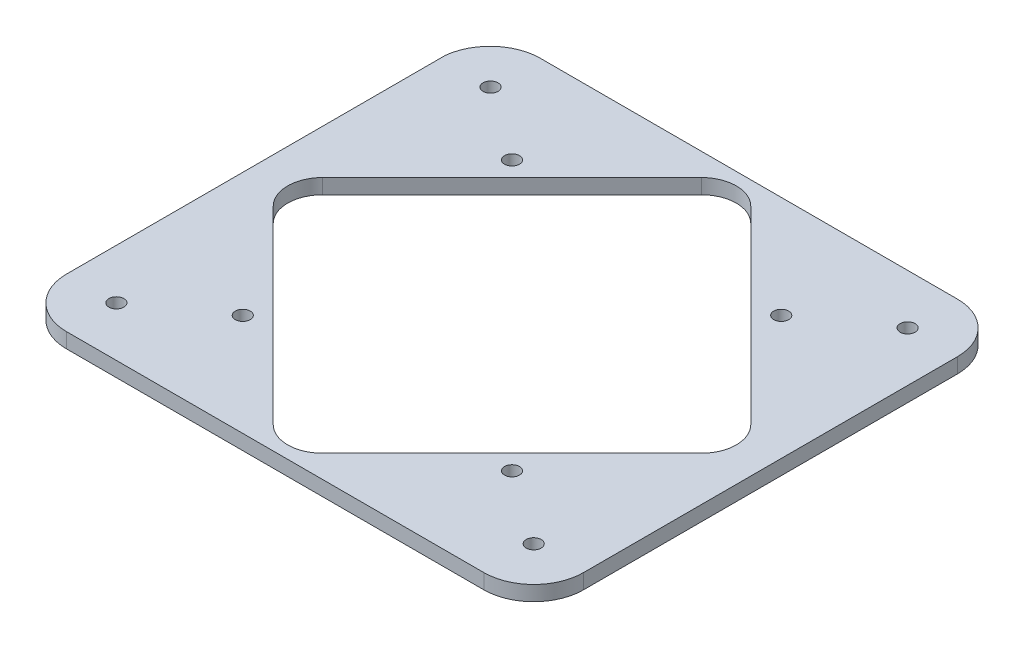
ISO-10303-21;
HEADER;
FILE_DESCRIPTION(('STEP AP214'),'2;1');
FILE_NAME('part.step','',(''),(''),'','','');
FILE_SCHEMA(('AUTOMOTIVE_DESIGN { 1 0 10303 214 1 1 1 1 }'));
ENDSEC;
DATA;
#1=APPLICATION_CONTEXT('core data for automotive mechanical design processes');
#2=APPLICATION_PROTOCOL_DEFINITION('international standard','automotive_design',2000,#1);
#3=PRODUCT_CONTEXT('',#1,'mechanical');
#4=PRODUCT('Part','Part','',(#3));
#5=PRODUCT_RELATED_PRODUCT_CATEGORY('part','',(#4));
#6=PRODUCT_DEFINITION_FORMATION('','',#4);
#7=PRODUCT_DEFINITION_CONTEXT('part definition',#1,'design');
#8=PRODUCT_DEFINITION('design','',#6,#7);
#9=PRODUCT_DEFINITION_SHAPE('','',#8);
#10=(LENGTH_UNIT() NAMED_UNIT(*) SI_UNIT(.MILLI.,.METRE.));
#11=(NAMED_UNIT(*) PLANE_ANGLE_UNIT() SI_UNIT($,.RADIAN.));
#12=(NAMED_UNIT(*) SI_UNIT($,.STERADIAN.) SOLID_ANGLE_UNIT());
#13=UNCERTAINTY_MEASURE_WITH_UNIT(LENGTH_MEASURE(1.E-05),#10,'distance_accuracy_value','');
#14=(GEOMETRIC_REPRESENTATION_CONTEXT(3) GLOBAL_UNCERTAINTY_ASSIGNED_CONTEXT((#13)) GLOBAL_UNIT_ASSIGNED_CONTEXT((#10,
#11,#12)) REPRESENTATION_CONTEXT('',''));
#15=CARTESIAN_POINT('',(0.,0.,0.));
#16=DIRECTION('',(0.,0.,1.));
#17=DIRECTION('',(1.,0.,0.));
#18=AXIS2_PLACEMENT_3D('',#15,#16,#17);
#19=CARTESIAN_POINT('',(58.3428128049057,3.,-85.8972079945477));
#20=DIRECTION('',(0.,1.,0.));
#21=DIRECTION('',(0.,0.,1.));
#22=AXIS2_PLACEMENT_3D('',#19,#20,#21);
#23=PLANE('',#22);
#24=CARTESIAN_POINT('',(127.15030832697,3.,-21.4999828091964));
#25=DIRECTION('',(0.,1.,0.));
#26=DIRECTION('',(0.,0.,1.));
#27=AXIS2_PLACEMENT_3D('',#24,#25,#26);
#28=CIRCLE('',#27,1.5);
#29=CARTESIAN_POINT('',(127.15030832697,3.,-19.9999828091964));
#30=VERTEX_POINT('',#29);
#31=EDGE_CURVE('E658',#30,#30,#28,.T.);
#32=ORIENTED_EDGE('',*,*,#31,.F.);
#33=EDGE_LOOP('',(#32));
#34=FACE_BOUND('',#33,.T.);
#35=CARTESIAN_POINT('',(58.3003,3.,-11.));
#36=DIRECTION('',(0.,1.,0.));
#37=DIRECTION('',(0.,0.,1.));
#38=AXIS2_PLACEMENT_3D('',#35,#36,#37);
#39=CIRCLE('',#38,1.5);
#40=CARTESIAN_POINT('',(58.3003,3.,-9.49999999999998));
#41=VERTEX_POINT('',#40);
#42=EDGE_CURVE('E670',#41,#41,#39,.T.);
#43=ORIENTED_EDGE('',*,*,#42,.F.);
#44=EDGE_LOOP('',(#43));
#45=FACE_BOUND('',#44,.T.);
#46=CARTESIAN_POINT('',(73.150306055341,3.,-75.5000305458296));
#47=DIRECTION('',(0.,1.,0.));
#48=DIRECTION('',(0.,0.,1.));
#49=AXIS2_PLACEMENT_3D('',#46,#47,#48);
#50=CIRCLE('',#49,1.5);
#51=CARTESIAN_POINT('',(73.150306055341,3.,-74.0000305458296));
#52=VERTEX_POINT('',#51);
#53=EDGE_CURVE('E682',#52,#52,#50,.T.);
#54=ORIENTED_EDGE('',*,*,#53,.F.);
#55=EDGE_LOOP('',(#54));
#56=FACE_BOUND('',#55,.T.);
#57=CARTESIAN_POINT('',(142.00022454147,3.,-86.));
#58=DIRECTION('',(0.,1.,0.));
#59=DIRECTION('',(0.,0.,1.));
#60=AXIS2_PLACEMENT_3D('',#57,#58,#59);
#61=CIRCLE('',#60,1.5);
#62=CARTESIAN_POINT('',(142.00022454147,3.,-84.4999999999999));
#63=VERTEX_POINT('',#62);
#64=EDGE_CURVE('E202',#63,#63,#61,.T.);
#65=ORIENTED_EDGE('',*,*,#64,.F.);
#66=EDGE_LOOP('',(#65));
#67=FACE_BOUND('',#66,.T.);
#68=CARTESIAN_POINT('',(58.3428128049057,3.,-85.8972079945477));
#69=DIRECTION('',(0.,1.,0.));
#70=DIRECTION('',(0.,0.,1.));
#71=AXIS2_PLACEMENT_3D('',#68,#69,#70);
#72=CIRCLE('',#71,10.1028814525367);
#73=CARTESIAN_POINT('',(58.3003000000001,3.,-95.9999999999999));
#74=VERTEX_POINT('',#73);
#75=CARTESIAN_POINT('',(48.3001000000004,3.,-86.9981771867594));
#76=VERTEX_POINT('',#75);
#77=EDGE_CURVE('E234',#74,#76,#72,.T.);
#78=ORIENTED_EDGE('',*,*,#77,.T.);
#79=DIRECTION('',(0.,0.,1.));
#80=VECTOR('',#79,1.);
#81=CARTESIAN_POINT('',(48.3001000000004,3.,-72.6415143233471));
#82=LINE('',#81,#80);
#83=CARTESIAN_POINT('',(48.3001000000003,3.,-24.0443854545442));
#84=VERTEX_POINT('',#83);
#85=EDGE_CURVE('E237',#76,#84,#82,.T.);
#86=ORIENTED_EDGE('',*,*,#85,.T.);
#87=DIRECTION('',(1.53322669203158E-05,0.,0.999999999882461));
#88=VECTOR('',#87,1.);
#89=CARTESIAN_POINT('',(48.3003,3.,-10.9999999999969));
#90=LINE('',#89,#88);
#91=CARTESIAN_POINT('',(48.3003,3.,-10.9999999999969));
#92=VERTEX_POINT('',#91);
#93=EDGE_CURVE('E240',#84,#92,#90,.T.);
#94=ORIENTED_EDGE('',*,*,#93,.T.);
#95=CARTESIAN_POINT('',(58.3003608133547,3.,-11.0000608133547));
#96=DIRECTION('',(0.,1.,0.));
#97=DIRECTION('',(0.,0.,1.));
#98=AXIS2_PLACEMENT_3D('',#95,#96,#97);
#99=CIRCLE('',#98,10.0000608135396);
#100=CARTESIAN_POINT('',(58.3003,3.,-1.));
#101=VERTEX_POINT('',#100);
#102=EDGE_CURVE('E242',#92,#101,#99,.T.);
#103=ORIENTED_EDGE('',*,*,#102,.T.);
#104=DIRECTION('',(1.,0.,0.));
#105=VECTOR('',#104,1.);
#106=CARTESIAN_POINT('',(58.3003,3.,-1.));
#107=LINE('',#106,#105);
#108=CARTESIAN_POINT('',(142.0003,3.,-0.999999999999975));
#109=VERTEX_POINT('',#108);
#110=EDGE_CURVE('E244',#101,#109,#107,.T.);
#111=ORIENTED_EDGE('',*,*,#110,.T.);
#112=CARTESIAN_POINT('',(142.00022454147,3.,-10.9999754582755));
#113=DIRECTION('',(0.,1.,0.));
#114=DIRECTION('',(0.,0.,1.));
#115=AXIS2_PLACEMENT_3D('',#112,#113,#114);
#116=CIRCLE('',#115,9.99997545856024);
#117=CARTESIAN_POINT('',(152.0002,3.,-10.9999999999346));
#118=VERTEX_POINT('',#117);
#119=EDGE_CURVE('E246',#109,#118,#116,.T.);
#120=ORIENTED_EDGE('',*,*,#119,.T.);
#121=DIRECTION('',(0.,0.,-1.));
#122=VECTOR('',#121,1.);
#123=CARTESIAN_POINT('',(152.0002,3.,-79.3684502165218));
#124=LINE('',#123,#122);
#125=CARTESIAN_POINT('',(152.0002,3.,-85.9999999998859));
#126=VERTEX_POINT('',#125);
#127=EDGE_CURVE('E248',#118,#126,#124,.T.);
#128=ORIENTED_EDGE('',*,*,#127,.T.);
#129=CARTESIAN_POINT('',(142.00030989673,3.,-86.0001098961311));
#130=DIRECTION('',(0.,1.,0.));
#131=DIRECTION('',(0.,0.,1.));
#132=AXIS2_PLACEMENT_3D('',#129,#130,#131);
#133=CIRCLE('',#132,9.99989010387383);
#134=CARTESIAN_POINT('',(142.0003,3.,-96.));
#135=VERTEX_POINT('',#134);
#136=EDGE_CURVE('E250',#126,#135,#133,.T.);
#137=ORIENTED_EDGE('',*,*,#136,.T.);
#138=DIRECTION('',(-0.999999986247782,0.,0.000165844615415532));
#139=VECTOR('',#138,1.);
#140=CARTESIAN_POINT('',(140.500584614507,3.,-95.9997512802752));
#141=LINE('',#140,#139);
#142=CARTESIAN_POINT('',(140.500584614507,3.,-95.9997512802752));
#143=VERTEX_POINT('',#142);
#144=EDGE_CURVE('E252',#135,#143,#141,.T.);
#145=ORIENTED_EDGE('',*,*,#144,.T.);
#146=DIRECTION('',(-0.999999999986851,0.,-5.12821083905116E-06));
#147=VECTOR('',#146,1.);
#148=CARTESIAN_POINT('',(140.500584614507,3.,-95.9997512802752));
#149=LINE('',#148,#147);
#150=CARTESIAN_POINT('',(82.5005846152699,3.,-96.0000487165039));
#151=VERTEX_POINT('',#150);
#152=EDGE_CURVE('E254',#143,#151,#149,.T.);
#153=ORIENTED_EDGE('',*,*,#152,.T.);
#154=DIRECTION('',(-0.999999999997974,0.,2.01305500154321E-06));
#155=VECTOR('',#154,1.);
#156=CARTESIAN_POINT('',(82.5005846152699,3.,-96.0000487165039));
#157=LINE('',#156,#155);
#158=EDGE_CURVE('E256',#151,#74,#157,.T.);
#159=ORIENTED_EDGE('',*,*,#158,.T.);
#160=EDGE_LOOP('',(#78,#86,#94,#103,#111,#120,#128,#137,#145,#153,#159));
#161=FACE_BOUND('',#160,.T.);
#162=DIRECTION('',(-0.707106781186549,0.,-0.707106781186546));
#163=VECTOR('',#162,1.);
#164=CARTESIAN_POINT('',(143.091425496954,3.,-53.4497102004735));
#165=LINE('',#164,#163);
#166=CARTESIAN_POINT('',(143.091425496954,3.,-53.4497102004735));
#167=VERTEX_POINT('',#166);
#168=CARTESIAN_POINT('',(105.100047468306,3.,-91.4410882291217));
#169=VERTEX_POINT('',#168);
#170=EDGE_CURVE('E172',#167,#169,#165,.T.);
#171=ORIENTED_EDGE('',*,*,#170,.F.);
#172=CARTESIAN_POINT('',(138.141678028648,3.,-48.4999627321676));
#173=DIRECTION('',(0.,1.,0.));
#174=DIRECTION('',(0.,0.,1.));
#175=AXIS2_PLACEMENT_3D('',#172,#173,#174);
#176=CIRCLE('',#175,7.00000000000001);
#177=CARTESIAN_POINT('',(143.091425496954,3.,-43.5502152638618));
#178=VERTEX_POINT('',#177);
#179=EDGE_CURVE('E164',#178,#167,#176,.T.);
#180=ORIENTED_EDGE('',*,*,#179,.F.);
#181=DIRECTION('',(0.707106781186547,0.,-0.707106781186548));
#182=VECTOR('',#181,1.);
#183=CARTESIAN_POINT('',(105.100047468306,3.,-5.55883723521331));
#184=LINE('',#183,#182);
#185=CARTESIAN_POINT('',(105.100047468306,3.,-5.55883723521336));
#186=VERTEX_POINT('',#185);
#187=EDGE_CURVE('E199',#186,#178,#184,.T.);
#188=ORIENTED_EDGE('',*,*,#187,.F.);
#189=CARTESIAN_POINT('',(100.1503,3.,-10.5085847035191));
#190=DIRECTION('',(0.,1.,0.));
#191=DIRECTION('',(0.,0.,1.));
#192=AXIS2_PLACEMENT_3D('',#189,#190,#191);
#193=CIRCLE('',#192,7.);
#194=CARTESIAN_POINT('',(95.2005525316941,3.,-5.55883723521331));
#195=VERTEX_POINT('',#194);
#196=EDGE_CURVE('E197',#195,#186,#193,.T.);
#197=ORIENTED_EDGE('',*,*,#196,.F.);
#198=DIRECTION('',(0.707106781186548,0.,0.707106781186547));
#199=VECTOR('',#198,1.);
#200=CARTESIAN_POINT('',(57.2091745030458,3.,-43.5502152638616));
#201=LINE('',#200,#199);
#202=CARTESIAN_POINT('',(57.2091745030458,3.,-43.5502152638616));
#203=VERTEX_POINT('',#202);
#204=EDGE_CURVE('E195',#203,#195,#201,.T.);
#205=ORIENTED_EDGE('',*,*,#204,.F.);
#206=CARTESIAN_POINT('',(62.1589219713516,3.,-48.4999627321675));
#207=DIRECTION('',(0.,1.,0.));
#208=DIRECTION('',(0.,0.,1.));
#209=AXIS2_PLACEMENT_3D('',#206,#207,#208);
#210=CIRCLE('',#209,7.00000000000002);
#211=CARTESIAN_POINT('',(57.2091745030457,3.,-53.4497102004733));
#212=VERTEX_POINT('',#211);
#213=EDGE_CURVE('E193',#212,#203,#210,.T.);
#214=ORIENTED_EDGE('',*,*,#213,.F.);
#215=DIRECTION('',(-0.707106781186548,0.,0.707106781186547));
#216=VECTOR('',#215,1.);
#217=CARTESIAN_POINT('',(95.2005525316942,3.,-91.4410882291217));
#218=LINE('',#217,#216);
#219=CARTESIAN_POINT('',(95.2005525316942,3.,-91.4410882291217));
#220=VERTEX_POINT('',#219);
#221=EDGE_CURVE('E188',#220,#212,#218,.T.);
#222=ORIENTED_EDGE('',*,*,#221,.F.);
#223=CARTESIAN_POINT('',(100.1503,3.,-86.4913407608159));
#224=DIRECTION('',(0.,1.,0.));
#225=DIRECTION('',(0.,0.,1.));
#226=AXIS2_PLACEMENT_3D('',#223,#224,#225);
#227=CIRCLE('',#226,6.99999999999995);
#228=EDGE_CURVE('E186',#169,#220,#227,.T.);
#229=ORIENTED_EDGE('',*,*,#228,.F.);
#230=EDGE_LOOP('',(#171,#180,#188,#197,#205,#214,#222,#229));
#231=FACE_BOUND('',#230,.T.);
#232=CARTESIAN_POINT('',(127.15030832697,3.,-75.5000305458296));
#233=DIRECTION('',(0.,1.,0.));
#234=DIRECTION('',(0.,0.,1.));
#235=AXIS2_PLACEMENT_3D('',#232,#233,#234);
#236=CIRCLE('',#235,1.5);
#237=CARTESIAN_POINT('',(127.15030832697,3.,-74.0000305458296));
#238=VERTEX_POINT('',#237);
#239=EDGE_CURVE('E688',#238,#238,#236,.T.);
#240=ORIENTED_EDGE('',*,*,#239,.F.);
#241=EDGE_LOOP('',(#240));
#242=FACE_BOUND('',#241,.T.);
#243=CARTESIAN_POINT('',(58.3427519915511,3.,-86.));
#244=DIRECTION('',(0.,1.,0.));
#245=DIRECTION('',(0.,0.,1.));
#246=AXIS2_PLACEMENT_3D('',#243,#244,#245);
#247=CIRCLE('',#246,1.5);
#248=CARTESIAN_POINT('',(58.3427519915511,3.,-84.4999999999999));
#249=VERTEX_POINT('',#248);
#250=EDGE_CURVE('E676',#249,#249,#247,.T.);
#251=ORIENTED_EDGE('',*,*,#250,.F.);
#252=EDGE_LOOP('',(#251));
#253=FACE_BOUND('',#252,.T.);
#254=CARTESIAN_POINT('',(73.150306055341,3.,-21.4999828091964));
#255=DIRECTION('',(0.,1.,0.));
#256=DIRECTION('',(0.,0.,1.));
#257=AXIS2_PLACEMENT_3D('',#254,#255,#256);
#258=CIRCLE('',#257,1.5);
#259=CARTESIAN_POINT('',(73.150306055341,3.,-19.9999828091964));
#260=VERTEX_POINT('',#259);
#261=EDGE_CURVE('E664',#260,#260,#258,.T.);
#262=ORIENTED_EDGE('',*,*,#261,.F.);
#263=EDGE_LOOP('',(#262));
#264=FACE_BOUND('',#263,.T.);
#265=CARTESIAN_POINT('',(142.00022454147,3.,-10.9999754582755));
#266=DIRECTION('',(0.,1.,0.));
#267=DIRECTION('',(0.,0.,1.));
#268=AXIS2_PLACEMENT_3D('',#265,#266,#267);
#269=CIRCLE('',#268,1.5);
#270=CARTESIAN_POINT('',(142.00022454147,3.,-9.49997545827551));
#271=VERTEX_POINT('',#270);
#272=EDGE_CURVE('E649',#271,#271,#269,.T.);
#273=ORIENTED_EDGE('',*,*,#272,.F.);
#274=EDGE_LOOP('',(#273));
#275=FACE_BOUND('',#274,.T.);
#276=ADVANCED_FACE('F33',(#34,#45,#56,#67,#161,#231,#242,#253,#264,#275),#23,.T.);
#277=CARTESIAN_POINT('',(58.3428128049057,0.,-85.8972079945477));
#278=DIRECTION('',(0.,1.,0.));
#279=DIRECTION('',(0.,0.,1.));
#280=AXIS2_PLACEMENT_3D('',#277,#278,#279);
#281=PLANE('',#280);
#282=CARTESIAN_POINT('',(58.3428128049057,0.,-85.8972079945477));
#283=DIRECTION('',(0.,1.,0.));
#284=DIRECTION('',(0.,0.,1.));
#285=AXIS2_PLACEMENT_3D('',#282,#283,#284);
#286=CIRCLE('',#285,10.1028814525367);
#287=CARTESIAN_POINT('',(58.3003000000001,0.,-95.9999999999999));
#288=VERTEX_POINT('',#287);
#289=CARTESIAN_POINT('',(48.3001000000004,0.,-86.9981771867594));
#290=VERTEX_POINT('',#289);
#291=EDGE_CURVE('E180',#288,#290,#286,.T.);
#292=ORIENTED_EDGE('',*,*,#291,.F.);
#293=DIRECTION('',(-0.999999999997974,0.,2.01305500154321E-06));
#294=VECTOR('',#293,1.);
#295=CARTESIAN_POINT('',(82.5005846152699,0.,-96.0000487165039));
#296=LINE('',#295,#294);
#297=CARTESIAN_POINT('',(82.5005846152699,0.,-96.0000487165039));
#298=VERTEX_POINT('',#297);
#299=EDGE_CURVE('E238',#298,#288,#296,.T.);
#300=ORIENTED_EDGE('',*,*,#299,.F.);
#301=DIRECTION('',(-0.999999999986851,0.,-5.12821083995188E-06));
#302=VECTOR('',#301,1.);
#303=CARTESIAN_POINT('',(108.500584614928,0.,-95.9999153830221));
#304=LINE('',#303,#302);
#305=CARTESIAN_POINT('',(140.500584614507,0.,-95.9997512802752));
#306=VERTEX_POINT('',#305);
#307=EDGE_CURVE('E279',#306,#298,#304,.T.);
#308=ORIENTED_EDGE('',*,*,#307,.F.);
#309=DIRECTION('',(-0.999999986247782,0.,0.000165844615415532));
#310=VECTOR('',#309,1.);
#311=CARTESIAN_POINT('',(140.500584614507,0.,-95.9997512802752));
#312=LINE('',#311,#310);
#313=CARTESIAN_POINT('',(142.0003,0.,-96.));
#314=VERTEX_POINT('',#313);
#315=EDGE_CURVE('E276',#314,#306,#312,.T.);
#316=ORIENTED_EDGE('',*,*,#315,.F.);
#317=CARTESIAN_POINT('',(142.00030989673,0.,-86.0001098961311));
#318=DIRECTION('',(0.,1.,0.));
#319=DIRECTION('',(0.,0.,1.));
#320=AXIS2_PLACEMENT_3D('',#317,#318,#319);
#321=CIRCLE('',#320,9.99989010387383);
#322=CARTESIAN_POINT('',(152.0002,0.,-85.9999999998859));
#323=VERTEX_POINT('',#322);
#324=EDGE_CURVE('E274',#323,#314,#321,.T.);
#325=ORIENTED_EDGE('',*,*,#324,.F.);
#326=DIRECTION('',(0.,0.,-1.));
#327=VECTOR('',#326,1.);
#328=CARTESIAN_POINT('',(152.0002,0.,-79.3684502165218));
#329=LINE('',#328,#327);
#330=CARTESIAN_POINT('',(152.0002,0.,-10.9999999999346));
#331=VERTEX_POINT('',#330);
#332=EDGE_CURVE('E272',#331,#323,#329,.T.);
#333=ORIENTED_EDGE('',*,*,#332,.F.);
#334=CARTESIAN_POINT('',(142.00022454147,0.,-10.9999754582755));
#335=DIRECTION('',(0.,1.,0.));
#336=DIRECTION('',(0.,0.,1.));
#337=AXIS2_PLACEMENT_3D('',#334,#335,#336);
#338=CIRCLE('',#337,9.99997545856024);
#339=CARTESIAN_POINT('',(142.0003,0.,-0.999999999999975));
#340=VERTEX_POINT('',#339);
#341=EDGE_CURVE('E269',#340,#331,#338,.T.);
#342=ORIENTED_EDGE('',*,*,#341,.F.);
#343=DIRECTION('',(1.,0.,0.));
#344=VECTOR('',#343,1.);
#345=CARTESIAN_POINT('',(58.3003,0.,-1.));
#346=LINE('',#345,#344);
#347=CARTESIAN_POINT('',(58.3003,0.,-1.));
#348=VERTEX_POINT('',#347);
#349=EDGE_CURVE('E267',#348,#340,#346,.T.);
#350=ORIENTED_EDGE('',*,*,#349,.F.);
#351=CARTESIAN_POINT('',(58.3003608133547,0.,-11.0000608133547));
#352=DIRECTION('',(0.,1.,0.));
#353=DIRECTION('',(0.,0.,1.));
#354=AXIS2_PLACEMENT_3D('',#351,#352,#353);
#355=CIRCLE('',#354,10.0000608135396);
#356=CARTESIAN_POINT('',(48.3003,0.,-10.9999999999969));
#357=VERTEX_POINT('',#356);
#358=EDGE_CURVE('E265',#357,#348,#355,.T.);
#359=ORIENTED_EDGE('',*,*,#358,.F.);
#360=DIRECTION('',(1.53322669203158E-05,0.,0.999999999882461));
#361=VECTOR('',#360,1.);
#362=CARTESIAN_POINT('',(48.3003,0.,-10.9999999999969));
#363=LINE('',#362,#361);
#364=CARTESIAN_POINT('',(48.3001000000003,0.,-24.0443854545442));
#365=VERTEX_POINT('',#364);
#366=EDGE_CURVE('E263',#365,#357,#363,.T.);
#367=ORIENTED_EDGE('',*,*,#366,.F.);
#368=DIRECTION('',(0.,0.,1.));
#369=VECTOR('',#368,1.);
#370=CARTESIAN_POINT('',(48.3001000000004,0.,-50.5));
#371=LINE('',#370,#369);
#372=EDGE_CURVE('E261',#290,#365,#371,.T.);
#373=ORIENTED_EDGE('',*,*,#372,.F.);
#374=EDGE_LOOP('',(#292,#300,#308,#316,#325,#333,#342,#350,#359,#367,#373));
#375=FACE_BOUND('',#374,.T.);
#376=CARTESIAN_POINT('',(138.141678028648,0.,-48.4999627321676));
#377=DIRECTION('',(0.,1.,0.));
#378=DIRECTION('',(0.,0.,1.));
#379=AXIS2_PLACEMENT_3D('',#376,#377,#378);
#380=CIRCLE('',#379,7.00000000000001);
#381=CARTESIAN_POINT('',(143.091425496954,0.,-43.5502152638618));
#382=VERTEX_POINT('',#381);
#383=CARTESIAN_POINT('',(143.091425496954,0.,-53.4497102004735));
#384=VERTEX_POINT('',#383);
#385=EDGE_CURVE('E56',#382,#384,#380,.T.);
#386=ORIENTED_EDGE('',*,*,#385,.T.);
#387=DIRECTION('',(-0.707106781186549,0.,-0.707106781186546));
#388=VECTOR('',#387,1.);
#389=CARTESIAN_POINT('',(143.091425496954,0.,-53.4497102004735));
#390=LINE('',#389,#388);
#391=CARTESIAN_POINT('',(105.100047468306,0.,-91.4410882291217));
#392=VERTEX_POINT('',#391);
#393=EDGE_CURVE('E179',#384,#392,#390,.T.);
#394=ORIENTED_EDGE('',*,*,#393,.T.);
#395=CARTESIAN_POINT('',(100.1503,0.,-86.4913407608159));
#396=DIRECTION('',(0.,1.,0.));
#397=DIRECTION('',(0.,0.,1.));
#398=AXIS2_PLACEMENT_3D('',#395,#396,#397);
#399=CIRCLE('',#398,6.99999999999995);
#400=CARTESIAN_POINT('',(95.2005525316942,0.,-91.4410882291217));
#401=VERTEX_POINT('',#400);
#402=EDGE_CURVE('E204',#392,#401,#399,.T.);
#403=ORIENTED_EDGE('',*,*,#402,.T.);
#404=DIRECTION('',(-0.707106781186548,0.,0.707106781186547));
#405=VECTOR('',#404,1.);
#406=CARTESIAN_POINT('',(76.5584169079632,0.,-72.7989526053908));
#407=LINE('',#406,#405);
#408=CARTESIAN_POINT('',(57.2091745030457,0.,-53.4497102004733));
#409=VERTEX_POINT('',#408);
#410=EDGE_CURVE('E207',#401,#409,#407,.T.);
#411=ORIENTED_EDGE('',*,*,#410,.T.);
#412=CARTESIAN_POINT('',(62.1589219713516,0.,-48.4999627321675));
#413=DIRECTION('',(0.,1.,0.));
#414=DIRECTION('',(0.,0.,1.));
#415=AXIS2_PLACEMENT_3D('',#412,#413,#414);
#416=CIRCLE('',#415,7.00000000000002);
#417=CARTESIAN_POINT('',(57.2091745030458,0.,-43.5502152638616));
#418=VERTEX_POINT('',#417);
#419=EDGE_CURVE('E210',#409,#418,#416,.T.);
#420=ORIENTED_EDGE('',*,*,#419,.T.);
#421=DIRECTION('',(0.707106781186548,0.,0.707106781186547));
#422=VECTOR('',#421,1.);
#423=CARTESIAN_POINT('',(87.0501863651894,0.,-13.709203401718));
#424=LINE('',#423,#422);
#425=CARTESIAN_POINT('',(95.2005525316941,0.,-5.55883723521331));
#426=VERTEX_POINT('',#425);
#427=EDGE_CURVE('E213',#418,#426,#424,.T.);
#428=ORIENTED_EDGE('',*,*,#427,.T.);
#429=CARTESIAN_POINT('',(100.1503,0.,-10.5085847035191));
#430=DIRECTION('',(0.,1.,0.));
#431=DIRECTION('',(0.,0.,1.));
#432=AXIS2_PLACEMENT_3D('',#429,#430,#431);
#433=CIRCLE('',#432,7.);
#434=CARTESIAN_POINT('',(105.100047468306,0.,-5.55883723521331));
#435=VERTEX_POINT('',#434);
#436=EDGE_CURVE('E216',#426,#435,#433,.T.);
#437=ORIENTED_EDGE('',*,*,#436,.T.);
#438=DIRECTION('',(0.707106781186548,0.,-0.707106781186547));
#439=VECTOR('',#438,1.);
#440=CARTESIAN_POINT('',(124.449289873223,0.,-24.9080796401308));
#441=LINE('',#440,#439);
#442=EDGE_CURVE('E173',#435,#382,#441,.T.);
#443=ORIENTED_EDGE('',*,*,#442,.T.);
#444=EDGE_LOOP('',(#386,#394,#403,#411,#420,#428,#437,#443));
#445=FACE_BOUND('',#444,.T.);
#446=CARTESIAN_POINT('',(142.00022454147,0.,-86.));
#447=DIRECTION('',(0.,1.,0.));
#448=DIRECTION('',(0.,0.,1.));
#449=AXIS2_PLACEMENT_3D('',#446,#447,#448);
#450=CIRCLE('',#449,1.5);
#451=CARTESIAN_POINT('',(142.00022454147,0.,-84.4999999999999));
#452=VERTEX_POINT('',#451);
#453=EDGE_CURVE('E691',#452,#452,#450,.T.);
#454=ORIENTED_EDGE('',*,*,#453,.T.);
#455=EDGE_LOOP('',(#454));
#456=FACE_BOUND('',#455,.T.);
#457=CARTESIAN_POINT('',(127.15030832697,0.,-75.5000305458296));
#458=DIRECTION('',(0.,1.,0.));
#459=DIRECTION('',(0.,0.,1.));
#460=AXIS2_PLACEMENT_3D('',#457,#458,#459);
#461=CIRCLE('',#460,1.5);
#462=CARTESIAN_POINT('',(127.15030832697,0.,-74.0000305458296));
#463=VERTEX_POINT('',#462);
#464=EDGE_CURVE('E685',#463,#463,#461,.T.);
#465=ORIENTED_EDGE('',*,*,#464,.T.);
#466=EDGE_LOOP('',(#465));
#467=FACE_BOUND('',#466,.T.);
#468=CARTESIAN_POINT('',(73.150306055341,0.,-75.5000305458296));
#469=DIRECTION('',(0.,1.,0.));
#470=DIRECTION('',(0.,0.,1.));
#471=AXIS2_PLACEMENT_3D('',#468,#469,#470);
#472=CIRCLE('',#471,1.5);
#473=CARTESIAN_POINT('',(73.150306055341,0.,-74.0000305458296));
#474=VERTEX_POINT('',#473);
#475=EDGE_CURVE('E679',#474,#474,#472,.T.);
#476=ORIENTED_EDGE('',*,*,#475,.T.);
#477=EDGE_LOOP('',(#476));
#478=FACE_BOUND('',#477,.T.);
#479=CARTESIAN_POINT('',(58.3427519915511,0.,-86.));
#480=DIRECTION('',(0.,1.,0.));
#481=DIRECTION('',(0.,0.,1.));
#482=AXIS2_PLACEMENT_3D('',#479,#480,#481);
#483=CIRCLE('',#482,1.5);
#484=CARTESIAN_POINT('',(58.3427519915511,0.,-84.4999999999999));
#485=VERTEX_POINT('',#484);
#486=EDGE_CURVE('E673',#485,#485,#483,.T.);
#487=ORIENTED_EDGE('',*,*,#486,.T.);
#488=EDGE_LOOP('',(#487));
#489=FACE_BOUND('',#488,.T.);
#490=CARTESIAN_POINT('',(58.3003,0.,-11.));
#491=DIRECTION('',(0.,1.,0.));
#492=DIRECTION('',(0.,0.,1.));
#493=AXIS2_PLACEMENT_3D('',#490,#491,#492);
#494=CIRCLE('',#493,1.5);
#495=CARTESIAN_POINT('',(58.3003,0.,-9.49999999999998));
#496=VERTEX_POINT('',#495);
#497=EDGE_CURVE('E667',#496,#496,#494,.T.);
#498=ORIENTED_EDGE('',*,*,#497,.T.);
#499=EDGE_LOOP('',(#498));
#500=FACE_BOUND('',#499,.T.);
#501=CARTESIAN_POINT('',(73.150306055341,0.,-21.4999828091964));
#502=DIRECTION('',(0.,1.,0.));
#503=DIRECTION('',(0.,0.,1.));
#504=AXIS2_PLACEMENT_3D('',#501,#502,#503);
#505=CIRCLE('',#504,1.5);
#506=CARTESIAN_POINT('',(73.150306055341,0.,-19.9999828091964));
#507=VERTEX_POINT('',#506);
#508=EDGE_CURVE('E661',#507,#507,#505,.T.);
#509=ORIENTED_EDGE('',*,*,#508,.T.);
#510=EDGE_LOOP('',(#509));
#511=FACE_BOUND('',#510,.T.);
#512=CARTESIAN_POINT('',(127.15030832697,0.,-21.4999828091964));
#513=DIRECTION('',(0.,1.,0.));
#514=DIRECTION('',(0.,0.,1.));
#515=AXIS2_PLACEMENT_3D('',#512,#513,#514);
#516=CIRCLE('',#515,1.5);
#517=CARTESIAN_POINT('',(127.15030832697,0.,-19.9999828091964));
#518=VERTEX_POINT('',#517);
#519=EDGE_CURVE('E655',#518,#518,#516,.T.);
#520=ORIENTED_EDGE('',*,*,#519,.T.);
#521=EDGE_LOOP('',(#520));
#522=FACE_BOUND('',#521,.T.);
#523=CARTESIAN_POINT('',(142.00022454147,0.,-10.9999754582755));
#524=DIRECTION('',(0.,1.,0.));
#525=DIRECTION('',(0.,0.,1.));
#526=AXIS2_PLACEMENT_3D('',#523,#524,#525);
#527=CIRCLE('',#526,1.5);
#528=CARTESIAN_POINT('',(142.00022454147,0.,-9.49997545827551));
#529=VERTEX_POINT('',#528);
#530=EDGE_CURVE('E652',#529,#529,#527,.T.);
#531=ORIENTED_EDGE('',*,*,#530,.T.);
#532=EDGE_LOOP('',(#531));
#533=FACE_BOUND('',#532,.T.);
#534=ADVANCED_FACE('F318',(#375,#445,#456,#467,#478,#489,#500,#511,#522,#533),#281,.F.);
#535=CARTESIAN_POINT('',(58.3428128049057,3.,-85.8972079945477));
#536=DIRECTION('',(0.,-1.,0.));
#537=DIRECTION('',(0.,0.,-1.));
#538=AXIS2_PLACEMENT_3D('',#535,#536,#537);
#539=CYLINDRICAL_SURFACE('',#538,10.1028814525367);
#540=ORIENTED_EDGE('',*,*,#291,.T.);
#541=DIRECTION('',(0.,-1.,0.));
#542=VECTOR('',#541,1.);
#543=CARTESIAN_POINT('',(48.3001000000004,3.,-86.9981771867594));
#544=LINE('',#543,#542);
#545=EDGE_CURVE('E11',#76,#290,#544,.T.);
#546=ORIENTED_EDGE('',*,*,#545,.F.);
#547=ORIENTED_EDGE('',*,*,#77,.F.);
#548=DIRECTION('',(0.,-1.,0.));
#549=VECTOR('',#548,1.);
#550=CARTESIAN_POINT('',(58.3003000000001,3.,-95.9999999999999));
#551=LINE('',#550,#549);
#552=EDGE_CURVE('E258',#74,#288,#551,.T.);
#553=ORIENTED_EDGE('',*,*,#552,.T.);
#554=EDGE_LOOP('',(#540,#546,#547,#553));
#555=FACE_BOUND('',#554,.T.);
#556=ADVANCED_FACE('F35',(#555),#539,.T.);
#557=CARTESIAN_POINT('',(48.3001000000004,3.,-50.5));
#558=DIRECTION('',(1.,0.,0.));
#559=DIRECTION('',(0.,0.,-1.));
#560=AXIS2_PLACEMENT_3D('',#557,#558,#559);
#561=PLANE('',#560);
#562=ORIENTED_EDGE('',*,*,#372,.T.);
#563=DIRECTION('',(0.,-1.,0.));
#564=VECTOR('',#563,1.);
#565=CARTESIAN_POINT('',(48.3001000000003,3.,-24.0443854545442));
#566=LINE('',#565,#564);
#567=EDGE_CURVE('E41',#84,#365,#566,.T.);
#568=ORIENTED_EDGE('',*,*,#567,.F.);
#569=ORIENTED_EDGE('',*,*,#85,.F.);
#570=ORIENTED_EDGE('',*,*,#545,.T.);
#571=EDGE_LOOP('',(#562,#568,#569,#570));
#572=FACE_BOUND('',#571,.T.);
#573=ADVANCED_FACE('F335',(#572),#561,.F.);
#574=CARTESIAN_POINT('',(48.3003,3.,-10.9999999999969));
#575=DIRECTION('',(0.999999999882461,0.,-1.53322669203158E-05));
#576=DIRECTION('',(-1.53322669203158E-05,0.,-0.999999999882461));
#577=AXIS2_PLACEMENT_3D('',#574,#575,#576);
#578=PLANE('',#577);
#579=ORIENTED_EDGE('',*,*,#366,.T.);
#580=DIRECTION('',(0.,-1.,0.));
#581=VECTOR('',#580,1.);
#582=CARTESIAN_POINT('',(48.3003,3.,-10.9999999999969));
#583=LINE('',#582,#581);
#584=EDGE_CURVE('E305',#92,#357,#583,.T.);
#585=ORIENTED_EDGE('',*,*,#584,.F.);
#586=ORIENTED_EDGE('',*,*,#93,.F.);
#587=ORIENTED_EDGE('',*,*,#567,.T.);
#588=EDGE_LOOP('',(#579,#585,#586,#587));
#589=FACE_BOUND('',#588,.T.);
#590=ADVANCED_FACE('F312',(#589),#578,.F.);
#591=CARTESIAN_POINT('',(58.3003608133547,3.,-11.0000608133547));
#592=DIRECTION('',(0.,-1.,0.));
#593=DIRECTION('',(0.,0.,-1.));
#594=AXIS2_PLACEMENT_3D('',#591,#592,#593);
#595=CYLINDRICAL_SURFACE('',#594,10.0000608135396);
#596=ORIENTED_EDGE('',*,*,#358,.T.);
#597=DIRECTION('',(0.,-1.,0.));
#598=VECTOR('',#597,1.);
#599=CARTESIAN_POINT('',(58.3003,3.,-1.));
#600=LINE('',#599,#598);
#601=EDGE_CURVE('E302',#101,#348,#600,.T.);
#602=ORIENTED_EDGE('',*,*,#601,.F.);
#603=ORIENTED_EDGE('',*,*,#102,.F.);
#604=ORIENTED_EDGE('',*,*,#584,.T.);
#605=EDGE_LOOP('',(#596,#602,#603,#604));
#606=FACE_BOUND('',#605,.T.);
#607=ADVANCED_FACE('F324',(#606),#595,.T.);
#608=CARTESIAN_POINT('',(58.3003,3.,-1.));
#609=DIRECTION('',(0.,0.,-1.));
#610=DIRECTION('',(-1.,0.,0.));
#611=AXIS2_PLACEMENT_3D('',#608,#609,#610);
#612=PLANE('',#611);
#613=ORIENTED_EDGE('',*,*,#349,.T.);
#614=DIRECTION('',(0.,-1.,0.));
#615=VECTOR('',#614,1.);
#616=CARTESIAN_POINT('',(142.0003,3.,-0.999999999999975));
#617=LINE('',#616,#615);
#618=EDGE_CURVE('E299',#109,#340,#617,.T.);
#619=ORIENTED_EDGE('',*,*,#618,.F.);
#620=ORIENTED_EDGE('',*,*,#110,.F.);
#621=ORIENTED_EDGE('',*,*,#601,.T.);
#622=EDGE_LOOP('',(#613,#619,#620,#621));
#623=FACE_BOUND('',#622,.T.);
#624=ADVANCED_FACE('F328',(#623),#612,.F.);
#625=CARTESIAN_POINT('',(142.00022454147,3.,-10.9999754582755));
#626=DIRECTION('',(0.,-1.,0.));
#627=DIRECTION('',(0.,0.,-1.));
#628=AXIS2_PLACEMENT_3D('',#625,#626,#627);
#629=CYLINDRICAL_SURFACE('',#628,9.99997545856024);
#630=ORIENTED_EDGE('',*,*,#341,.T.);
#631=DIRECTION('',(0.,-1.,0.));
#632=VECTOR('',#631,1.);
#633=CARTESIAN_POINT('',(152.0002,3.,-10.9999999999346));
#634=LINE('',#633,#632);
#635=EDGE_CURVE('E296',#118,#331,#634,.T.);
#636=ORIENTED_EDGE('',*,*,#635,.F.);
#637=ORIENTED_EDGE('',*,*,#119,.F.);
#638=ORIENTED_EDGE('',*,*,#618,.T.);
#639=EDGE_LOOP('',(#630,#636,#637,#638));
#640=FACE_BOUND('',#639,.T.);
#641=ADVANCED_FACE('F361',(#640),#629,.T.);
#642=CARTESIAN_POINT('',(152.0002,3.,-79.3684502165218));
#643=DIRECTION('',(-1.,0.,0.));
#644=DIRECTION('',(0.,0.,1.));
#645=AXIS2_PLACEMENT_3D('',#642,#643,#644);
#646=PLANE('',#645);
#647=ORIENTED_EDGE('',*,*,#332,.T.);
#648=DIRECTION('',(0.,-1.,0.));
#649=VECTOR('',#648,1.);
#650=CARTESIAN_POINT('',(152.0002,3.,-85.9999999998859));
#651=LINE('',#650,#649);
#652=EDGE_CURVE('E293',#126,#323,#651,.T.);
#653=ORIENTED_EDGE('',*,*,#652,.F.);
#654=ORIENTED_EDGE('',*,*,#127,.F.);
#655=ORIENTED_EDGE('',*,*,#635,.T.);
#656=EDGE_LOOP('',(#647,#653,#654,#655));
#657=FACE_BOUND('',#656,.T.);
#658=ADVANCED_FACE('F359',(#657),#646,.F.);
#659=CARTESIAN_POINT('',(142.00030989673,3.,-86.0001098961311));
#660=DIRECTION('',(0.,-1.,0.));
#661=DIRECTION('',(0.,0.,-1.));
#662=AXIS2_PLACEMENT_3D('',#659,#660,#661);
#663=CYLINDRICAL_SURFACE('',#662,9.99989010387383);
#664=ORIENTED_EDGE('',*,*,#324,.T.);
#665=DIRECTION('',(0.,-1.,0.));
#666=VECTOR('',#665,1.);
#667=CARTESIAN_POINT('',(142.0003,3.,-96.));
#668=LINE('',#667,#666);
#669=EDGE_CURVE('E290',#135,#314,#668,.T.);
#670=ORIENTED_EDGE('',*,*,#669,.F.);
#671=ORIENTED_EDGE('',*,*,#136,.F.);
#672=ORIENTED_EDGE('',*,*,#652,.T.);
#673=EDGE_LOOP('',(#664,#670,#671,#672));
#674=FACE_BOUND('',#673,.T.);
#675=ADVANCED_FACE('F354',(#674),#663,.T.);
#676=CARTESIAN_POINT('',(140.500584614507,3.,-95.9997512802752));
#677=DIRECTION('',(0.000165844615415532,0.,0.999999986247782));
#678=DIRECTION('',(0.999999986247782,0.,-0.000165844615415532));
#679=AXIS2_PLACEMENT_3D('',#676,#677,#678);
#680=PLANE('',#679);
#681=ORIENTED_EDGE('',*,*,#315,.T.);
#682=DIRECTION('',(0.,-1.,0.));
#683=VECTOR('',#682,1.);
#684=CARTESIAN_POINT('',(140.500584614507,3.,-95.9997512802752));
#685=LINE('',#684,#683);
#686=EDGE_CURVE('E287',#143,#306,#685,.T.);
#687=ORIENTED_EDGE('',*,*,#686,.F.);
#688=ORIENTED_EDGE('',*,*,#144,.F.);
#689=ORIENTED_EDGE('',*,*,#669,.T.);
#690=EDGE_LOOP('',(#681,#687,#688,#689));
#691=FACE_BOUND('',#690,.T.);
#692=ADVANCED_FACE('F350',(#691),#680,.F.);
#693=CARTESIAN_POINT('',(108.500584614928,3.,-95.9999153830221));
#694=DIRECTION('',(-5.12821083995188E-06,0.,0.999999999986851));
#695=DIRECTION('',(0.999999999986851,0.,5.12821083995188E-06));
#696=AXIS2_PLACEMENT_3D('',#693,#694,#695);
#697=PLANE('',#696);
#698=ORIENTED_EDGE('',*,*,#307,.T.);
#699=DIRECTION('',(0.,-1.,0.));
#700=VECTOR('',#699,1.);
#701=CARTESIAN_POINT('',(82.5005846152699,3.,-96.0000487165039));
#702=LINE('',#701,#700);
#703=EDGE_CURVE('E284',#151,#298,#702,.T.);
#704=ORIENTED_EDGE('',*,*,#703,.F.);
#705=ORIENTED_EDGE('',*,*,#152,.F.);
#706=ORIENTED_EDGE('',*,*,#686,.T.);
#707=EDGE_LOOP('',(#698,#704,#705,#706));
#708=FACE_BOUND('',#707,.T.);
#709=ADVANCED_FACE('F346',(#708),#697,.F.);
#710=CARTESIAN_POINT('',(82.5005846152699,3.,-96.0000487165039));
#711=DIRECTION('',(2.01305500154321E-06,0.,0.999999999997974));
#712=DIRECTION('',(0.999999999997974,0.,-2.01305500154321E-06));
#713=AXIS2_PLACEMENT_3D('',#710,#711,#712);
#714=PLANE('',#713);
#715=ORIENTED_EDGE('',*,*,#299,.T.);
#716=ORIENTED_EDGE('',*,*,#552,.F.);
#717=ORIENTED_EDGE('',*,*,#158,.F.);
#718=ORIENTED_EDGE('',*,*,#703,.T.);
#719=EDGE_LOOP('',(#715,#716,#717,#718));
#720=FACE_BOUND('',#719,.T.);
#721=ADVANCED_FACE('F341',(#720),#714,.F.);
#722=CARTESIAN_POINT('',(138.141678028648,3.,-48.4999627321676));
#723=DIRECTION('',(0.,-1.,0.));
#724=DIRECTION('',(0.,0.,-1.));
#725=AXIS2_PLACEMENT_3D('',#722,#723,#724);
#726=CYLINDRICAL_SURFACE('',#725,7.00000000000001);
#727=ORIENTED_EDGE('',*,*,#385,.F.);
#728=DIRECTION('',(0.,-1.,0.));
#729=VECTOR('',#728,1.);
#730=CARTESIAN_POINT('',(143.091425496954,3.,-43.5502152638618));
#731=LINE('',#730,#729);
#732=EDGE_CURVE('E168',#178,#382,#731,.T.);
#733=ORIENTED_EDGE('',*,*,#732,.F.);
#734=ORIENTED_EDGE('',*,*,#179,.T.);
#735=DIRECTION('',(0.,-1.,0.));
#736=VECTOR('',#735,1.);
#737=CARTESIAN_POINT('',(143.091425496954,3.,-53.4497102004735));
#738=LINE('',#737,#736);
#739=EDGE_CURVE('E167',#167,#384,#738,.T.);
#740=ORIENTED_EDGE('',*,*,#739,.T.);
#741=EDGE_LOOP('',(#727,#733,#734,#740));
#742=FACE_BOUND('',#741,.T.);
#743=ADVANCED_FACE('F166',(#742),#726,.F.);
#744=CARTESIAN_POINT('',(143.091425496954,3.,-53.4497102004735));
#745=DIRECTION('',(-0.707106781186546,0.,0.707106781186549));
#746=DIRECTION('',(0.707106781186549,0.,0.707106781186546));
#747=AXIS2_PLACEMENT_3D('',#744,#745,#746);
#748=PLANE('',#747);
#749=ORIENTED_EDGE('',*,*,#393,.F.);
#750=ORIENTED_EDGE('',*,*,#739,.F.);
#751=ORIENTED_EDGE('',*,*,#170,.T.);
#752=DIRECTION('',(0.,-1.,0.));
#753=VECTOR('',#752,1.);
#754=CARTESIAN_POINT('',(105.100047468306,3.,-91.4410882291217));
#755=LINE('',#754,#753);
#756=EDGE_CURVE('E181',#169,#392,#755,.T.);
#757=ORIENTED_EDGE('',*,*,#756,.T.);
#758=EDGE_LOOP('',(#749,#750,#751,#757));
#759=FACE_BOUND('',#758,.T.);
#760=ADVANCED_FACE('F176',(#759),#748,.T.);
#761=CARTESIAN_POINT('',(100.1503,3.,-86.4913407608159));
#762=DIRECTION('',(0.,-1.,0.));
#763=DIRECTION('',(0.,0.,-1.));
#764=AXIS2_PLACEMENT_3D('',#761,#762,#763);
#765=CYLINDRICAL_SURFACE('',#764,6.99999999999995);
#766=ORIENTED_EDGE('',*,*,#402,.F.);
#767=ORIENTED_EDGE('',*,*,#756,.F.);
#768=ORIENTED_EDGE('',*,*,#228,.T.);
#769=DIRECTION('',(0.,-1.,0.));
#770=VECTOR('',#769,1.);
#771=CARTESIAN_POINT('',(95.2005525316942,3.,-91.4410882291217));
#772=LINE('',#771,#770);
#773=EDGE_CURVE('E230',#220,#401,#772,.T.);
#774=ORIENTED_EDGE('',*,*,#773,.T.);
#775=EDGE_LOOP('',(#766,#767,#768,#774));
#776=FACE_BOUND('',#775,.T.);
#777=ADVANCED_FACE('F416',(#776),#765,.F.);
#778=CARTESIAN_POINT('',(76.5584169079632,3.,-72.7989526053908));
#779=DIRECTION('',(0.707106781186547,0.,0.707106781186548));
#780=DIRECTION('',(0.707106781186548,0.,-0.707106781186547));
#781=AXIS2_PLACEMENT_3D('',#778,#779,#780);
#782=PLANE('',#781);
#783=ORIENTED_EDGE('',*,*,#410,.F.);
#784=ORIENTED_EDGE('',*,*,#773,.F.);
#785=ORIENTED_EDGE('',*,*,#221,.T.);
#786=DIRECTION('',(0.,-1.,0.));
#787=VECTOR('',#786,1.);
#788=CARTESIAN_POINT('',(57.2091745030457,3.,-53.4497102004733));
#789=LINE('',#788,#787);
#790=EDGE_CURVE('E228',#212,#409,#789,.T.);
#791=ORIENTED_EDGE('',*,*,#790,.T.);
#792=EDGE_LOOP('',(#783,#784,#785,#791));
#793=FACE_BOUND('',#792,.T.);
#794=ADVANCED_FACE('F422',(#793),#782,.T.);
#795=CARTESIAN_POINT('',(62.1589219713516,3.,-48.4999627321675));
#796=DIRECTION('',(0.,-1.,0.));
#797=DIRECTION('',(0.,0.,-1.));
#798=AXIS2_PLACEMENT_3D('',#795,#796,#797);
#799=CYLINDRICAL_SURFACE('',#798,7.00000000000002);
#800=ORIENTED_EDGE('',*,*,#419,.F.);
#801=ORIENTED_EDGE('',*,*,#790,.F.);
#802=ORIENTED_EDGE('',*,*,#213,.T.);
#803=DIRECTION('',(0.,-1.,0.));
#804=VECTOR('',#803,1.);
#805=CARTESIAN_POINT('',(57.2091745030458,3.,-43.5502152638616));
#806=LINE('',#805,#804);
#807=EDGE_CURVE('E225',#203,#418,#806,.T.);
#808=ORIENTED_EDGE('',*,*,#807,.T.);
#809=EDGE_LOOP('',(#800,#801,#802,#808));
#810=FACE_BOUND('',#809,.T.);
#811=ADVANCED_FACE('F430',(#810),#799,.F.);
#812=CARTESIAN_POINT('',(87.0501863651894,3.,-13.709203401718));
#813=DIRECTION('',(0.707106781186547,0.,-0.707106781186548));
#814=DIRECTION('',(-0.707106781186548,0.,-0.707106781186547));
#815=AXIS2_PLACEMENT_3D('',#812,#813,#814);
#816=PLANE('',#815);
#817=ORIENTED_EDGE('',*,*,#427,.F.);
#818=ORIENTED_EDGE('',*,*,#807,.F.);
#819=ORIENTED_EDGE('',*,*,#204,.T.);
#820=DIRECTION('',(0.,-1.,0.));
#821=VECTOR('',#820,1.);
#822=CARTESIAN_POINT('',(95.2005525316941,3.,-5.55883723521331));
#823=LINE('',#822,#821);
#824=EDGE_CURVE('E223',#195,#426,#823,.T.);
#825=ORIENTED_EDGE('',*,*,#824,.T.);
#826=EDGE_LOOP('',(#817,#818,#819,#825));
#827=FACE_BOUND('',#826,.T.);
#828=ADVANCED_FACE('F438',(#827),#816,.T.);
#829=CARTESIAN_POINT('',(100.1503,3.,-10.5085847035191));
#830=DIRECTION('',(0.,-1.,0.));
#831=DIRECTION('',(0.,0.,-1.));
#832=AXIS2_PLACEMENT_3D('',#829,#830,#831);
#833=CYLINDRICAL_SURFACE('',#832,7.);
#834=ORIENTED_EDGE('',*,*,#436,.F.);
#835=ORIENTED_EDGE('',*,*,#824,.F.);
#836=ORIENTED_EDGE('',*,*,#196,.T.);
#837=DIRECTION('',(0.,-1.,0.));
#838=VECTOR('',#837,1.);
#839=CARTESIAN_POINT('',(105.100047468306,3.,-5.55883723521331));
#840=LINE('',#839,#838);
#841=EDGE_CURVE('E48',#186,#435,#840,.T.);
#842=ORIENTED_EDGE('',*,*,#841,.T.);
#843=EDGE_LOOP('',(#834,#835,#836,#842));
#844=FACE_BOUND('',#843,.T.);
#845=ADVANCED_FACE('F446',(#844),#833,.F.);
#846=CARTESIAN_POINT('',(124.449289873223,3.,-24.9080796401308));
#847=DIRECTION('',(-0.707106781186547,0.,-0.707106781186548));
#848=DIRECTION('',(-0.707106781186548,0.,0.707106781186547));
#849=AXIS2_PLACEMENT_3D('',#846,#847,#848);
#850=PLANE('',#849);
#851=ORIENTED_EDGE('',*,*,#442,.F.);
#852=ORIENTED_EDGE('',*,*,#841,.F.);
#853=ORIENTED_EDGE('',*,*,#187,.T.);
#854=ORIENTED_EDGE('',*,*,#732,.T.);
#855=EDGE_LOOP('',(#851,#852,#853,#854));
#856=FACE_BOUND('',#855,.T.);
#857=ADVANCED_FACE('F454',(#856),#850,.T.);
#858=CARTESIAN_POINT('',(142.00022454147,3.,-86.));
#859=DIRECTION('',(0.,-1.,0.));
#860=DIRECTION('',(0.,0.,-1.));
#861=AXIS2_PLACEMENT_3D('',#858,#859,#860);
#862=CYLINDRICAL_SURFACE('',#861,1.5);
#863=ORIENTED_EDGE('',*,*,#64,.T.);
#864=EDGE_LOOP('',(#863));
#865=FACE_BOUND('',#864,.T.);
#866=ORIENTED_EDGE('',*,*,#453,.F.);
#867=EDGE_LOOP('',(#866));
#868=FACE_BOUND('',#867,.T.);
#869=ADVANCED_FACE('F462',(#865,#868),#862,.F.);
#870=CARTESIAN_POINT('',(127.15030832697,3.,-75.5000305458296));
#871=DIRECTION('',(0.,-1.,0.));
#872=DIRECTION('',(0.,0.,-1.));
#873=AXIS2_PLACEMENT_3D('',#870,#871,#872);
#874=CYLINDRICAL_SURFACE('',#873,1.5);
#875=ORIENTED_EDGE('',*,*,#239,.T.);
#876=EDGE_LOOP('',(#875));
#877=FACE_BOUND('',#876,.T.);
#878=ORIENTED_EDGE('',*,*,#464,.F.);
#879=EDGE_LOOP('',(#878));
#880=FACE_BOUND('',#879,.T.);
#881=ADVANCED_FACE('F469',(#877,#880),#874,.F.);
#882=CARTESIAN_POINT('',(73.150306055341,3.,-75.5000305458296));
#883=DIRECTION('',(0.,-1.,0.));
#884=DIRECTION('',(0.,0.,-1.));
#885=AXIS2_PLACEMENT_3D('',#882,#883,#884);
#886=CYLINDRICAL_SURFACE('',#885,1.5);
#887=ORIENTED_EDGE('',*,*,#53,.T.);
#888=EDGE_LOOP('',(#887));
#889=FACE_BOUND('',#888,.T.);
#890=ORIENTED_EDGE('',*,*,#475,.F.);
#891=EDGE_LOOP('',(#890));
#892=FACE_BOUND('',#891,.T.);
#893=ADVANCED_FACE('F477',(#889,#892),#886,.F.);
#894=CARTESIAN_POINT('',(58.3427519915511,3.,-86.));
#895=DIRECTION('',(0.,-1.,0.));
#896=DIRECTION('',(0.,0.,-1.));
#897=AXIS2_PLACEMENT_3D('',#894,#895,#896);
#898=CYLINDRICAL_SURFACE('',#897,1.5);
#899=ORIENTED_EDGE('',*,*,#250,.T.);
#900=EDGE_LOOP('',(#899));
#901=FACE_BOUND('',#900,.T.);
#902=ORIENTED_EDGE('',*,*,#486,.F.);
#903=EDGE_LOOP('',(#902));
#904=FACE_BOUND('',#903,.T.);
#905=ADVANCED_FACE('F485',(#901,#904),#898,.F.);
#906=CARTESIAN_POINT('',(58.3003,3.,-11.));
#907=DIRECTION('',(0.,-1.,0.));
#908=DIRECTION('',(0.,0.,-1.));
#909=AXIS2_PLACEMENT_3D('',#906,#907,#908);
#910=CYLINDRICAL_SURFACE('',#909,1.5);
#911=ORIENTED_EDGE('',*,*,#42,.T.);
#912=EDGE_LOOP('',(#911));
#913=FACE_BOUND('',#912,.T.);
#914=ORIENTED_EDGE('',*,*,#497,.F.);
#915=EDGE_LOOP('',(#914));
#916=FACE_BOUND('',#915,.T.);
#917=ADVANCED_FACE('F493',(#913,#916),#910,.F.);
#918=CARTESIAN_POINT('',(73.150306055341,3.,-21.4999828091964));
#919=DIRECTION('',(0.,-1.,0.));
#920=DIRECTION('',(0.,0.,-1.));
#921=AXIS2_PLACEMENT_3D('',#918,#919,#920);
#922=CYLINDRICAL_SURFACE('',#921,1.5);
#923=ORIENTED_EDGE('',*,*,#261,.T.);
#924=EDGE_LOOP('',(#923));
#925=FACE_BOUND('',#924,.T.);
#926=ORIENTED_EDGE('',*,*,#508,.F.);
#927=EDGE_LOOP('',(#926));
#928=FACE_BOUND('',#927,.T.);
#929=ADVANCED_FACE('F501',(#925,#928),#922,.F.);
#930=CARTESIAN_POINT('',(127.15030832697,3.,-21.4999828091964));
#931=DIRECTION('',(0.,-1.,0.));
#932=DIRECTION('',(0.,0.,-1.));
#933=AXIS2_PLACEMENT_3D('',#930,#931,#932);
#934=CYLINDRICAL_SURFACE('',#933,1.5);
#935=ORIENTED_EDGE('',*,*,#31,.T.);
#936=EDGE_LOOP('',(#935));
#937=FACE_BOUND('',#936,.T.);
#938=ORIENTED_EDGE('',*,*,#519,.F.);
#939=EDGE_LOOP('',(#938));
#940=FACE_BOUND('',#939,.T.);
#941=ADVANCED_FACE('F509',(#937,#940),#934,.F.);
#942=CARTESIAN_POINT('',(142.00022454147,3.,-10.9999754582755));
#943=DIRECTION('',(0.,-1.,0.));
#944=DIRECTION('',(0.,0.,-1.));
#945=AXIS2_PLACEMENT_3D('',#942,#943,#944);
#946=CYLINDRICAL_SURFACE('',#945,1.5);
#947=ORIENTED_EDGE('',*,*,#272,.T.);
#948=EDGE_LOOP('',(#947));
#949=FACE_BOUND('',#948,.T.);
#950=ORIENTED_EDGE('',*,*,#530,.F.);
#951=EDGE_LOOP('',(#950));
#952=FACE_BOUND('',#951,.T.);
#953=ADVANCED_FACE('F517',(#949,#952),#946,.F.);
#954=CLOSED_SHELL('',(#276,#534,#556,#573,#590,#607,#624,#641,#658,#675,#692,#709,#721,#743,
#760,#777,#794,#811,#828,#845,#857,#869,#881,#893,#905,#917,#929,#941,#953));
#955=MANIFOLD_SOLID_BREP('B2',#954);
#956=ADVANCED_BREP_SHAPE_REPRESENTATION('',(#18,#955),#14);
#957=SHAPE_DEFINITION_REPRESENTATION(#9,#956);
ENDSEC;
END-ISO-10303-21;
